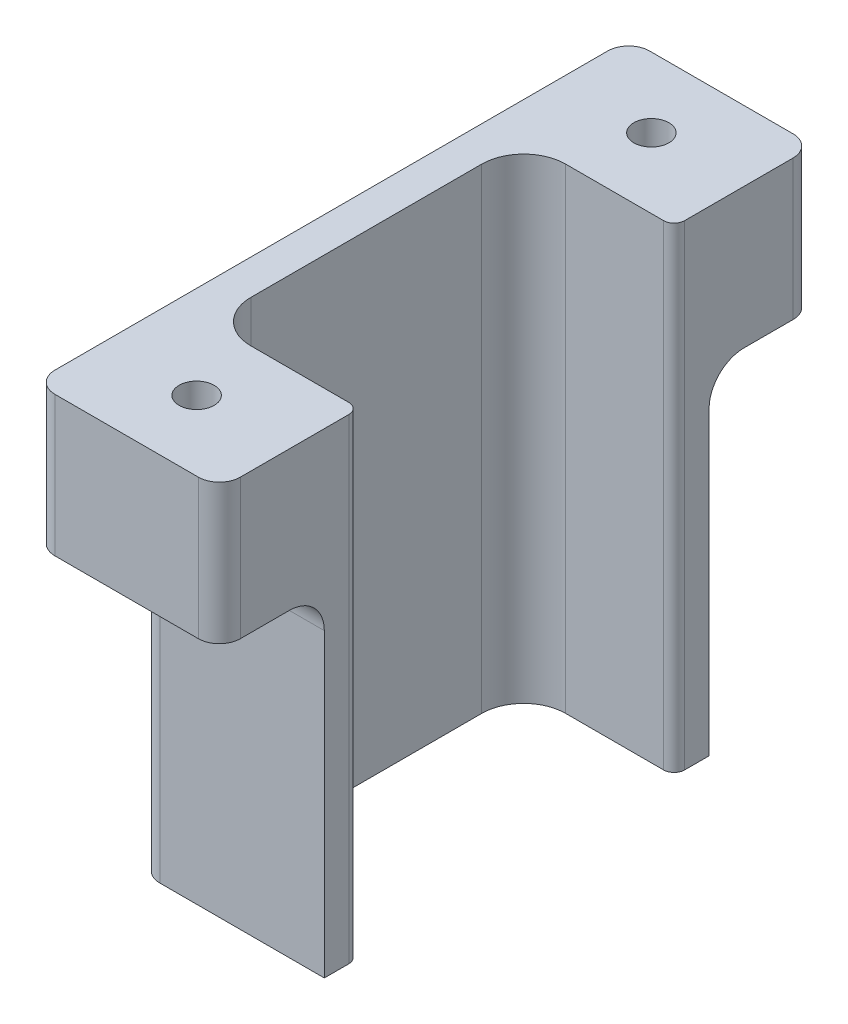
ISO-10303-21;
HEADER;
FILE_DESCRIPTION(('STEP AP214'),'2;1');
FILE_NAME('part.step','',(''),(''),'','','');
FILE_SCHEMA(('AUTOMOTIVE_DESIGN { 1 0 10303 214 1 1 1 1 }'));
ENDSEC;
DATA;
#1=APPLICATION_CONTEXT('core data for automotive mechanical design processes');
#2=APPLICATION_PROTOCOL_DEFINITION('international standard','automotive_design',2000,#1);
#3=PRODUCT_CONTEXT('',#1,'mechanical');
#4=PRODUCT('Part','Part','',(#3));
#5=PRODUCT_RELATED_PRODUCT_CATEGORY('part','',(#4));
#6=PRODUCT_DEFINITION_FORMATION('','',#4);
#7=PRODUCT_DEFINITION_CONTEXT('part definition',#1,'design');
#8=PRODUCT_DEFINITION('design','',#6,#7);
#9=PRODUCT_DEFINITION_SHAPE('','',#8);
#10=(LENGTH_UNIT() NAMED_UNIT(*) SI_UNIT(.MILLI.,.METRE.));
#11=(NAMED_UNIT(*) PLANE_ANGLE_UNIT() SI_UNIT($,.RADIAN.));
#12=(NAMED_UNIT(*) SI_UNIT($,.STERADIAN.) SOLID_ANGLE_UNIT());
#13=UNCERTAINTY_MEASURE_WITH_UNIT(LENGTH_MEASURE(1.E-05),#10,'distance_accuracy_value','');
#14=(GEOMETRIC_REPRESENTATION_CONTEXT(3) GLOBAL_UNCERTAINTY_ASSIGNED_CONTEXT((#13)) GLOBAL_UNIT_ASSIGNED_CONTEXT((#10,
#11,#12)) REPRESENTATION_CONTEXT('',''));
#15=CARTESIAN_POINT('',(0.,0.,0.));
#16=DIRECTION('',(0.,0.,1.));
#17=DIRECTION('',(1.,0.,0.));
#18=AXIS2_PLACEMENT_3D('',#15,#16,#17);
#19=CARTESIAN_POINT('',(-17.8800000000024,-68.,-42.499999999993));
#20=DIRECTION('',(-1.,0.,0.));
#21=DIRECTION('',(0.,0.,1.));
#22=AXIS2_PLACEMENT_3D('',#19,#20,#21);
#23=PLANE('',#22);
#24=DIRECTION('',(0.,0.,1.));
#25=VECTOR('',#24,1.);
#26=CARTESIAN_POINT('',(-17.8800000000018,-20.,-24.5000000000071));
#27=LINE('',#26,#25);
#28=CARTESIAN_POINT('',(-17.8800000000024,-20.,-39.500000000007));
#29=VERTEX_POINT('',#28);
#30=CARTESIAN_POINT('',(-17.8800000000021,-20.,-31.9161984871026));
#31=VERTEX_POINT('',#30);
#32=EDGE_CURVE('E249',#29,#31,#27,.T.);
#33=ORIENTED_EDGE('',*,*,#32,.T.);
#34=CARTESIAN_POINT('',(-17.8800000000021,-20.,-31.9161984871026));
#35=CARTESIAN_POINT('',(-17.8800000000023,-19.9999752730949,-31.7456852843473));
#36=CARTESIAN_POINT('',(-17.8800000000024,-20.0074935365896,-31.5752210421484));
#37=CARTESIAN_POINT('',(-17.8800000000025,-20.0369800495805,-31.2356908238179));
#38=CARTESIAN_POINT('',(-17.8800000000024,-20.0589355674878,-31.0666237484772));
#39=CARTESIAN_POINT('',(-17.8800000000024,-20.116463969022,-30.7320399614759));
#40=CARTESIAN_POINT('',(-17.8800000000024,-20.1519420271381,-30.5665068173239));
#41=CARTESIAN_POINT('',(-17.8800000000024,-20.2357731757258,-30.238702504611));
#42=CARTESIAN_POINT('',(-17.8800000000024,-20.2841301293885,-30.0764323305539));
#43=CARTESIAN_POINT('',(-17.8800000000024,-20.4069214648023,-29.7146234537957));
#44=CARTESIAN_POINT('',(-17.8800000000024,-20.4848649967622,-29.5162710714395));
#45=CARTESIAN_POINT('',(-17.8800000000024,-20.6579850710163,-29.1272491317108));
#46=CARTESIAN_POINT('',(-17.8800000000024,-20.7531650659685,-28.9365811229769));
#47=CARTESIAN_POINT('',(-17.8800000000024,-20.9589846921192,-28.5634220285451));
#48=CARTESIAN_POINT('',(-17.8800000000024,-21.0696489079492,-28.3809445678928));
#49=CARTESIAN_POINT('',(-17.8800000000024,-21.3043932006747,-28.0247740395487));
#50=CARTESIAN_POINT('',(-17.8800000000024,-21.4284787062314,-27.8510845684416));
#51=CARTESIAN_POINT('',(-17.8800000000024,-21.6768777004653,-27.5271148286793));
#52=CARTESIAN_POINT('',(-17.8800000000024,-21.8002489741906,-27.3761074431734));
#53=CARTESIAN_POINT('',(-17.8800000000024,-22.0551167288719,-27.0810870646629));
#54=CARTESIAN_POINT('',(-17.8800000000024,-22.1866151088374,-26.9370757205259));
#55=CARTESIAN_POINT('',(-17.8800000000025,-22.5914536856932,-26.5145394797686));
#56=CARTESIAN_POINT('',(-17.880000000003,-22.8749495256995,-26.245750264503));
#57=CARTESIAN_POINT('',(-17.8800000000018,-23.4594492174559,-25.7269875936144));
#58=CARTESIAN_POINT('',(-17.8800000000001,-23.760494827344,-25.4770625567149));
#59=CARTESIAN_POINT('',(-17.8800000000048,-24.3706229283548,-24.987621757178));
#60=CARTESIAN_POINT('',(-17.8800000000112,-24.6797026818117,-24.7481025211546));
#61=CARTESIAN_POINT('',(-17.8800000000023,-24.9925464416032,-24.5057735003997));
#62=CARTESIAN_POINT('',(-17.8800000000022,-24.9962732216266,-24.5028867490627));
#63=CARTESIAN_POINT('',(-17.8800000000021,-25.,-24.500000000007));
#64=B_SPLINE_CURVE_WITH_KNOTS('',3,(#34,#35,#36,#37,#38,#39,#40,#41,#42,#43,#44,#45,#46,#47,#48,
#49,#50,#51,#52,#53,#54,#55,#56,#57,#58,#59,#60,#61,#62,#63),.UNSPECIFIED.,.F.,.F.,(4,2,2,2,2,2,
2,2,2,2,2,2,2,2,4),(0.,0.511301398217874,1.02215250549165,1.52948533179293,2.03697051086635,
2.67538958433453,3.3139366820847,3.95350936853052,4.59334172451281,5.17800417118517,
5.76280375254001,6.93330785249414,8.10672075543524,9.27973892354765,9.29388105917143),.UNSPECIFIED.);
#65=CARTESIAN_POINT('',(-17.8800000000018,-25.,-24.5000000000071));
#66=VERTEX_POINT('',#65);
#67=EDGE_CURVE('E414',#31,#66,#64,.T.);
#68=ORIENTED_EDGE('',*,*,#67,.T.);
#69=DIRECTION('',(0.,-1.,0.));
#70=VECTOR('',#69,1.);
#71=CARTESIAN_POINT('',(-17.8800000000018,12.0351369592833,-24.5000000000071));
#72=LINE('',#71,#70);
#73=CARTESIAN_POINT('',(-17.8800000000018,-68.,-24.5000000000071));
#74=VERTEX_POINT('',#73);
#75=EDGE_CURVE('E247',#66,#74,#72,.T.);
#76=ORIENTED_EDGE('',*,*,#75,.T.);
#77=DIRECTION('',(0.,0.,1.));
#78=VECTOR('',#77,1.);
#79=CARTESIAN_POINT('',(-17.8800000000024,-68.,-42.499999999993));
#80=LINE('',#79,#78);
#81=CARTESIAN_POINT('',(-17.8800000000018,-68.,24.5000000000071));
#82=VERTEX_POINT('',#81);
#83=EDGE_CURVE('E353',#74,#82,#80,.T.);
#84=ORIENTED_EDGE('',*,*,#83,.T.);
#85=DIRECTION('',(0.,-1.,0.));
#86=VECTOR('',#85,1.);
#87=CARTESIAN_POINT('',(-17.8800000000018,12.0351369592833,24.5000000000071));
#88=LINE('',#87,#86);
#89=CARTESIAN_POINT('',(-17.8800000000018,-25.,24.5000000000071));
#90=VERTEX_POINT('',#89);
#91=EDGE_CURVE('E286',#90,#82,#88,.T.);
#92=ORIENTED_EDGE('',*,*,#91,.F.);
#93=CARTESIAN_POINT('',(-17.8800000000021,-20.,31.9161984871026));
#94=CARTESIAN_POINT('',(-17.8800000000023,-19.9999752730949,31.7456852843479));
#95=CARTESIAN_POINT('',(-17.8800000000024,-20.0074935365895,31.5752210421497));
#96=CARTESIAN_POINT('',(-17.8800000000025,-20.0369800495803,31.2356908238205));
#97=CARTESIAN_POINT('',(-17.8800000000024,-20.0589355674874,31.0666237484805));
#98=CARTESIAN_POINT('',(-17.8800000000024,-20.1164639690213,30.7320399614792));
#99=CARTESIAN_POINT('',(-17.8800000000024,-20.1519420271375,30.5665068173265));
#100=CARTESIAN_POINT('',(-17.8800000000024,-20.2357731757254,30.2387025046123));
#101=CARTESIAN_POINT('',(-17.8800000000024,-20.2841301293883,30.0764323305546));
#102=CARTESIAN_POINT('',(-17.8800000000024,-20.4069214648025,29.7146234537951));
#103=CARTESIAN_POINT('',(-17.8800000000024,-20.4848649967626,29.5162710714384));
#104=CARTESIAN_POINT('',(-17.8800000000024,-20.6579850710173,29.1272491317087));
#105=CARTESIAN_POINT('',(-17.8800000000024,-20.7531650659699,28.9365811229744));
#106=CARTESIAN_POINT('',(-17.8800000000024,-20.9589846921207,28.5634220285427));
#107=CARTESIAN_POINT('',(-17.8800000000024,-21.0696489079504,28.3809445678909));
#108=CARTESIAN_POINT('',(-17.8800000000024,-21.3043932006753,28.0247740395478));
#109=CARTESIAN_POINT('',(-17.8800000000024,-21.4284787062317,27.8510845684411));
#110=CARTESIAN_POINT('',(-17.8800000000024,-21.6768777004652,27.5271148286794));
#111=CARTESIAN_POINT('',(-17.8800000000024,-21.8002489741904,27.3761074431737));
#112=CARTESIAN_POINT('',(-17.8800000000024,-22.0551167288715,27.0810870646633));
#113=CARTESIAN_POINT('',(-17.8800000000024,-22.1866151088367,26.9370757205262));
#114=CARTESIAN_POINT('',(-17.8800000000025,-22.5914536856921,26.5145394797704));
#115=CARTESIAN_POINT('',(-17.880000000003,-22.8749495256988,26.2457502645071));
#116=CARTESIAN_POINT('',(-17.8800000000018,-23.4594492174515,25.7269875936149));
#117=CARTESIAN_POINT('',(-17.8800000000001,-23.7604948273356,25.4770625567094));
#118=CARTESIAN_POINT('',(-17.8800000000048,-24.3706229283592,24.9876217571867));
#119=CARTESIAN_POINT('',(-17.8800000000112,-24.679702681833,24.7481025211837));
#120=CARTESIAN_POINT('',(-17.8800000000023,-24.9925464416037,24.5057735004004));
#121=CARTESIAN_POINT('',(-17.8800000000022,-24.9962732216269,24.502886749063));
#122=CARTESIAN_POINT('',(-17.8800000000021,-25.,24.500000000007));
#123=B_SPLINE_CURVE_WITH_KNOTS('',3,(#93,#94,#95,#96,#97,#98,#99,#100,#101,#102,#103,#104,#105,
#106,#107,#108,#109,#110,#111,#112,#113,#114,#115,#116,#117,#118,#119,#120,#121,#122),
.UNSPECIFIED.,.F.,.F.,(4,2,2,2,2,2,2,2,2,2,2,2,2,2,4),(0.,0.511301398215926,1.02215250548769,
1.52948533179091,2.03697051086635,2.67538958433635,3.3139366820881,3.9535093685322,
4.59334172451282,5.17800417118479,5.7628037525391,6.93330785248986,8.10672075543246,
9.27973892354754,9.29388105917142),.UNSPECIFIED.);
#124=CARTESIAN_POINT('',(-17.8800000000021,-20.,31.9161984871026));
#125=VERTEX_POINT('',#124);
#126=EDGE_CURVE('E422',#90,#125,#123,.F.);
#127=ORIENTED_EDGE('',*,*,#126,.T.);
#128=DIRECTION('',(0.,0.,-1.));
#129=VECTOR('',#128,1.);
#130=CARTESIAN_POINT('',(-17.8800000000018,-20.,24.5000000000071));
#131=LINE('',#130,#129);
#132=CARTESIAN_POINT('',(-17.8800000000024,-20.,39.500000000007));
#133=VERTEX_POINT('',#132);
#134=EDGE_CURVE('E274',#133,#125,#131,.T.);
#135=ORIENTED_EDGE('',*,*,#134,.F.);
#136=DIRECTION('',(0.,1.,0.));
#137=VECTOR('',#136,1.);
#138=CARTESIAN_POINT('',(-17.8800000000024,-68.,39.500000000007));
#139=LINE('',#138,#137);
#140=CARTESIAN_POINT('',(-17.8800000000024,0.,39.500000000007));
#141=VERTEX_POINT('',#140);
#142=EDGE_CURVE('E382',#133,#141,#139,.T.);
#143=ORIENTED_EDGE('',*,*,#142,.T.);
#144=DIRECTION('',(0.,0.,1.));
#145=VECTOR('',#144,1.);
#146=CARTESIAN_POINT('',(-17.8800000000024,0.,-42.499999999993));
#147=LINE('',#146,#145);
#148=CARTESIAN_POINT('',(-17.8800000000024,0.,-39.499999999993));
#149=VERTEX_POINT('',#148);
#150=EDGE_CURVE('E364',#149,#141,#147,.T.);
#151=ORIENTED_EDGE('',*,*,#150,.F.);
#152=DIRECTION('',(0.,1.,0.));
#153=VECTOR('',#152,1.);
#154=CARTESIAN_POINT('',(-17.8800000000024,-68.,-39.499999999993));
#155=LINE('',#154,#153);
#156=EDGE_CURVE('E384',#149,#29,#155,.F.);
#157=ORIENTED_EDGE('',*,*,#156,.T.);
#158=EDGE_LOOP('',(#33,#68,#76,#84,#92,#127,#135,#143,#151,#157));
#159=FACE_BOUND('',#158,.T.);
#160=ADVANCED_FACE('F49',(#159),#23,.T.);
#161=CARTESIAN_POINT('',(0.,-68.,0.));
#162=DIRECTION('',(0.,1.,0.));
#163=DIRECTION('',(0.,0.,1.));
#164=AXIS2_PLACEMENT_3D('',#161,#162,#163);
#165=PLANE('',#164);
#166=CARTESIAN_POINT('',(-14.8800000000018,-68.,-24.500000000007));
#167=DIRECTION('',(0.,-1.,0.));
#168=DIRECTION('',(0.,0.,-1.));
#169=AXIS2_PLACEMENT_3D('',#166,#167,#168);
#170=CIRCLE('',#169,3.);
#171=CARTESIAN_POINT('',(-14.8800000000018,-68.,-27.500000000007));
#172=VERTEX_POINT('',#171);
#173=EDGE_CURVE('E256',#74,#172,#170,.T.);
#174=ORIENTED_EDGE('',*,*,#173,.T.);
#175=DIRECTION('',(1.,0.,0.));
#176=VECTOR('',#175,1.);
#177=CARTESIAN_POINT('',(-14.8800000000018,-68.,-27.500000000007));
#178=LINE('',#177,#176);
#179=CARTESIAN_POINT('',(8.61999999999824,-68.,-27.5000000000068));
#180=VERTEX_POINT('',#179);
#181=EDGE_CURVE('E259',#172,#180,#178,.T.);
#182=ORIENTED_EDGE('',*,*,#181,.T.);
#183=DIRECTION('',(0.,0.,-1.));
#184=VECTOR('',#183,1.);
#185=CARTESIAN_POINT('',(8.61999999999824,-68.,-42.499999999993));
#186=LINE('',#185,#184);
#187=CARTESIAN_POINT('',(8.61999999999786,-68.,-23.9999999999932));
#188=VERTEX_POINT('',#187);
#189=EDGE_CURVE('E354',#188,#180,#186,.T.);
#190=ORIENTED_EDGE('',*,*,#189,.F.);
#191=CARTESIAN_POINT('',(7.11999999999785,-68.,-23.9999999999932));
#192=DIRECTION('',(0.,1.,0.));
#193=DIRECTION('',(0.,0.,1.));
#194=AXIS2_PLACEMENT_3D('',#191,#192,#193);
#195=CIRCLE('',#194,1.50000000000001);
#196=CARTESIAN_POINT('',(7.11999999999785,-68.,-22.4999999999932));
#197=VERTEX_POINT('',#196);
#198=EDGE_CURVE('E280',#197,#188,#195,.T.);
#199=ORIENTED_EDGE('',*,*,#198,.F.);
#200=DIRECTION('',(1.,0.,0.));
#201=VECTOR('',#200,1.);
#202=CARTESIAN_POINT('',(-6.88000000000216,-68.,-22.4999999999931));
#203=LINE('',#202,#201);
#204=CARTESIAN_POINT('',(-6.88000000000216,-68.,-22.4999999999931));
#205=VERTEX_POINT('',#204);
#206=EDGE_CURVE('E295',#205,#197,#203,.T.);
#207=ORIENTED_EDGE('',*,*,#206,.F.);
#208=CARTESIAN_POINT('',(-6.88000000000211,-68.,-16.4999999999931));
#209=DIRECTION('',(0.,1.,0.));
#210=DIRECTION('',(0.,0.,1.));
#211=AXIS2_PLACEMENT_3D('',#208,#209,#210);
#212=CIRCLE('',#211,6.00000000000001);
#213=CARTESIAN_POINT('',(-12.8800000000021,-68.,-16.499999999993));
#214=VERTEX_POINT('',#213);
#215=EDGE_CURVE('E298',#214,#205,#212,.F.);
#216=ORIENTED_EDGE('',*,*,#215,.F.);
#217=DIRECTION('',(0.,0.,-1.));
#218=VECTOR('',#217,1.);
#219=CARTESIAN_POINT('',(-12.8800000000018,-68.,16.500000000007));
#220=LINE('',#219,#218);
#221=CARTESIAN_POINT('',(-12.8800000000018,-68.,16.500000000007));
#222=VERTEX_POINT('',#221);
#223=EDGE_CURVE('E301',#222,#214,#220,.T.);
#224=ORIENTED_EDGE('',*,*,#223,.F.);
#225=CARTESIAN_POINT('',(-6.88000000000177,-68.,16.5000000000069));
#226=DIRECTION('',(0.,1.,0.));
#227=DIRECTION('',(0.,0.,1.));
#228=AXIS2_PLACEMENT_3D('',#225,#226,#227);
#229=CIRCLE('',#228,6.);
#230=CARTESIAN_POINT('',(-6.88000000000177,-68.,22.5000000000069));
#231=VERTEX_POINT('',#230);
#232=EDGE_CURVE('E304',#231,#222,#229,.F.);
#233=ORIENTED_EDGE('',*,*,#232,.F.);
#234=DIRECTION('',(-1.,0.,0.));
#235=VECTOR('',#234,1.);
#236=CARTESIAN_POINT('',(7.11999999999829,-68.,22.5000000000068));
#237=LINE('',#236,#235);
#238=CARTESIAN_POINT('',(7.11999999999829,-68.,22.5000000000068));
#239=VERTEX_POINT('',#238);
#240=EDGE_CURVE('E307',#239,#231,#237,.T.);
#241=ORIENTED_EDGE('',*,*,#240,.F.);
#242=CARTESIAN_POINT('',(7.11999999999835,-68.,24.0000000000068));
#243=DIRECTION('',(0.,1.,0.));
#244=DIRECTION('',(0.,0.,1.));
#245=AXIS2_PLACEMENT_3D('',#242,#243,#244);
#246=CIRCLE('',#245,1.5);
#247=CARTESIAN_POINT('',(8.61999999999825,-68.,24.0000000000068));
#248=VERTEX_POINT('',#247);
#249=EDGE_CURVE('E310',#248,#239,#246,.T.);
#250=ORIENTED_EDGE('',*,*,#249,.F.);
#251=CARTESIAN_POINT('',(8.61999999999824,-68.,27.5000000000068));
#252=VERTEX_POINT('',#251);
#253=EDGE_CURVE('E351',#252,#248,#186,.T.);
#254=ORIENTED_EDGE('',*,*,#253,.F.);
#255=DIRECTION('',(1.,0.,0.));
#256=VECTOR('',#255,1.);
#257=CARTESIAN_POINT('',(-14.8800000000018,-68.,27.500000000007));
#258=LINE('',#257,#256);
#259=CARTESIAN_POINT('',(-14.8800000000018,-68.,27.500000000007));
#260=VERTEX_POINT('',#259);
#261=EDGE_CURVE('E270',#260,#252,#258,.T.);
#262=ORIENTED_EDGE('',*,*,#261,.F.);
#263=CARTESIAN_POINT('',(-14.8800000000018,-68.,24.500000000007));
#264=DIRECTION('',(0.,1.,0.));
#265=DIRECTION('',(0.,0.,1.));
#266=AXIS2_PLACEMENT_3D('',#263,#264,#265);
#267=CIRCLE('',#266,3.);
#268=EDGE_CURVE('E283',#82,#260,#267,.T.);
#269=ORIENTED_EDGE('',*,*,#268,.F.);
#270=ORIENTED_EDGE('',*,*,#83,.F.);
#271=EDGE_LOOP('',(#174,#182,#190,#199,#207,#216,#224,#233,#241,#250,#254,#262,#269,#270));
#272=FACE_BOUND('',#271,.T.);
#273=ADVANCED_FACE('F436',(#272),#165,.F.);
#274=CARTESIAN_POINT('',(8.61999999999824,-68.,-42.499999999993));
#275=DIRECTION('',(1.,0.,0.));
#276=DIRECTION('',(0.,0.,-1.));
#277=AXIS2_PLACEMENT_3D('',#274,#275,#276);
#278=PLANE('',#277);
#279=ORIENTED_EDGE('',*,*,#189,.T.);
#280=DIRECTION('',(0.,-1.,0.));
#281=VECTOR('',#280,1.);
#282=CARTESIAN_POINT('',(8.61999999999824,12.0351369592833,-27.5000000000068));
#283=LINE('',#282,#281);
#284=CARTESIAN_POINT('',(8.61999999999824,-25.,-27.5000000000068));
#285=VERTEX_POINT('',#284);
#286=EDGE_CURVE('E263',#285,#180,#283,.T.);
#287=ORIENTED_EDGE('',*,*,#286,.F.);
#288=CARTESIAN_POINT('',(8.61999999999824,-25.,-32.5000000000068));
#289=DIRECTION('',(1.,0.,0.));
#290=DIRECTION('',(0.,0.,-1.));
#291=AXIS2_PLACEMENT_3D('',#288,#289,#290);
#292=CIRCLE('',#291,5.);
#293=CARTESIAN_POINT('',(8.61999999999824,-20.,-32.5000000000068));
#294=VERTEX_POINT('',#293);
#295=EDGE_CURVE('E58',#285,#294,#292,.F.);
#296=ORIENTED_EDGE('',*,*,#295,.T.);
#297=DIRECTION('',(0.,0.,-1.));
#298=VECTOR('',#297,1.);
#299=CARTESIAN_POINT('',(8.61999999999825,-20.,-39.500000000007));
#300=LINE('',#299,#298);
#301=CARTESIAN_POINT('',(8.61999999999825,-20.,-39.500000000007));
#302=VERTEX_POINT('',#301);
#303=EDGE_CURVE('E246',#294,#302,#300,.T.);
#304=ORIENTED_EDGE('',*,*,#303,.T.);
#305=DIRECTION('',(0.,1.,0.));
#306=VECTOR('',#305,1.);
#307=CARTESIAN_POINT('',(8.61999999999824,-68.,-39.499999999993));
#308=LINE('',#307,#306);
#309=CARTESIAN_POINT('',(8.61999999999824,0.,-39.499999999993));
#310=VERTEX_POINT('',#309);
#311=EDGE_CURVE('E390',#302,#310,#308,.T.);
#312=ORIENTED_EDGE('',*,*,#311,.T.);
#313=DIRECTION('',(0.,0.,-1.));
#314=VECTOR('',#313,1.);
#315=CARTESIAN_POINT('',(8.61999999999824,0.,-42.499999999993));
#316=LINE('',#315,#314);
#317=CARTESIAN_POINT('',(8.61999999999824,0.,-23.9999999999932));
#318=VERTEX_POINT('',#317);
#319=EDGE_CURVE('E336',#318,#310,#316,.T.);
#320=ORIENTED_EDGE('',*,*,#319,.F.);
#321=DIRECTION('',(0.,1.,0.));
#322=VECTOR('',#321,1.);
#323=CARTESIAN_POINT('',(8.61999999999786,-68.001,-23.9999999999932));
#324=LINE('',#323,#322);
#325=EDGE_CURVE('E347',#188,#318,#324,.T.);
#326=ORIENTED_EDGE('',*,*,#325,.F.);
#327=EDGE_LOOP('',(#279,#287,#296,#304,#312,#320,#326));
#328=FACE_BOUND('',#327,.T.);
#329=ADVANCED_FACE('F445',(#328),#278,.T.);
#330=CARTESIAN_POINT('',(-17.8800000000024,-68.,-42.499999999993));
#331=DIRECTION('',(0.,0.,-1.));
#332=DIRECTION('',(-1.,0.,0.));
#333=AXIS2_PLACEMENT_3D('',#330,#331,#332);
#334=PLANE('',#333);
#335=DIRECTION('',(0.,1.,0.));
#336=VECTOR('',#335,1.);
#337=CARTESIAN_POINT('',(5.61999999999824,-68.,-42.499999999993));
#338=LINE('',#337,#336);
#339=CARTESIAN_POINT('',(5.61999999999824,0.,-42.499999999993));
#340=VERTEX_POINT('',#339);
#341=CARTESIAN_POINT('',(5.61999999999824,-20.,-42.499999999993));
#342=VERTEX_POINT('',#341);
#343=EDGE_CURVE('E357',#340,#342,#338,.F.);
#344=ORIENTED_EDGE('',*,*,#343,.T.);
#345=DIRECTION('',(-1.,0.,0.));
#346=VECTOR('',#345,1.);
#347=CARTESIAN_POINT('',(-14.8800000000024,-20.,-42.500000000007));
#348=LINE('',#347,#346);
#349=CARTESIAN_POINT('',(-14.8800000000024,-20.,-42.500000000007));
#350=VERTEX_POINT('',#349);
#351=EDGE_CURVE('E255',#342,#350,#348,.T.);
#352=ORIENTED_EDGE('',*,*,#351,.T.);
#353=DIRECTION('',(0.,1.,0.));
#354=VECTOR('',#353,1.);
#355=CARTESIAN_POINT('',(-14.8800000000024,-68.,-42.499999999993));
#356=LINE('',#355,#354);
#357=CARTESIAN_POINT('',(-14.8800000000024,0.,-42.499999999993));
#358=VERTEX_POINT('',#357);
#359=EDGE_CURVE('E372',#350,#358,#356,.T.);
#360=ORIENTED_EDGE('',*,*,#359,.T.);
#361=DIRECTION('',(-1.,0.,0.));
#362=VECTOR('',#361,1.);
#363=CARTESIAN_POINT('',(-17.8800000000024,0.,-42.499999999993));
#364=LINE('',#363,#362);
#365=EDGE_CURVE('E361',#340,#358,#364,.T.);
#366=ORIENTED_EDGE('',*,*,#365,.F.);
#367=EDGE_LOOP('',(#344,#352,#360,#366));
#368=FACE_BOUND('',#367,.T.);
#369=ADVANCED_FACE('F440',(#368),#334,.T.);
#370=CARTESIAN_POINT('',(-14.8800000000024,-68.,-39.499999999993));
#371=DIRECTION('',(0.,1.,0.));
#372=DIRECTION('',(0.,0.,1.));
#373=AXIS2_PLACEMENT_3D('',#370,#371,#372);
#374=CYLINDRICAL_SURFACE('',#373,3.);
#375=ORIENTED_EDGE('',*,*,#359,.F.);
#376=CARTESIAN_POINT('',(-14.8800000000024,-20.,-39.500000000007));
#377=DIRECTION('',(0.,-1.,0.));
#378=DIRECTION('',(0.,0.,-1.));
#379=AXIS2_PLACEMENT_3D('',#376,#377,#378);
#380=CIRCLE('',#379,3.);
#381=EDGE_CURVE('E252',#350,#29,#380,.F.);
#382=ORIENTED_EDGE('',*,*,#381,.T.);
#383=ORIENTED_EDGE('',*,*,#156,.F.);
#384=CARTESIAN_POINT('',(-14.8800000000024,0.,-39.499999999993));
#385=DIRECTION('',(0.,1.,0.));
#386=DIRECTION('',(0.,0.,1.));
#387=AXIS2_PLACEMENT_3D('',#384,#385,#386);
#388=CIRCLE('',#387,3.);
#389=EDGE_CURVE('E380',#358,#149,#388,.T.);
#390=ORIENTED_EDGE('',*,*,#389,.F.);
#391=EDGE_LOOP('',(#375,#382,#383,#390));
#392=FACE_BOUND('',#391,.T.);
#393=ADVANCED_FACE('F444',(#392),#374,.T.);
#394=CARTESIAN_POINT('',(5.61999999999824,-68.,-39.499999999993));
#395=DIRECTION('',(0.,1.,0.));
#396=DIRECTION('',(0.,0.,1.));
#397=AXIS2_PLACEMENT_3D('',#394,#395,#396);
#398=CYLINDRICAL_SURFACE('',#397,3.);
#399=ORIENTED_EDGE('',*,*,#311,.F.);
#400=CARTESIAN_POINT('',(5.61999999999825,-20.,-39.500000000007));
#401=DIRECTION('',(0.,-1.,0.));
#402=DIRECTION('',(0.,0.,-1.));
#403=AXIS2_PLACEMENT_3D('',#400,#401,#402);
#404=CIRCLE('',#403,3.);
#405=EDGE_CURVE('E243',#302,#342,#404,.F.);
#406=ORIENTED_EDGE('',*,*,#405,.T.);
#407=ORIENTED_EDGE('',*,*,#343,.F.);
#408=CARTESIAN_POINT('',(5.61999999999824,0.,-39.499999999993));
#409=DIRECTION('',(0.,1.,0.));
#410=DIRECTION('',(0.,0.,1.));
#411=AXIS2_PLACEMENT_3D('',#408,#409,#410);
#412=CIRCLE('',#411,3.);
#413=EDGE_CURVE('E378',#310,#340,#412,.T.);
#414=ORIENTED_EDGE('',*,*,#413,.F.);
#415=EDGE_LOOP('',(#399,#406,#407,#414));
#416=FACE_BOUND('',#415,.T.);
#417=ADVANCED_FACE('F454',(#416),#398,.T.);
#418=CARTESIAN_POINT('',(-17.8800000000024,-68.,42.500000000007));
#419=DIRECTION('',(0.,0.,1.));
#420=DIRECTION('',(1.,0.,0.));
#421=AXIS2_PLACEMENT_3D('',#418,#419,#420);
#422=PLANE('',#421);
#423=DIRECTION('',(0.,1.,0.));
#424=VECTOR('',#423,1.);
#425=CARTESIAN_POINT('',(-14.8800000000024,-68.,42.500000000007));
#426=LINE('',#425,#424);
#427=CARTESIAN_POINT('',(-14.8800000000024,0.,42.500000000007));
#428=VERTEX_POINT('',#427);
#429=CARTESIAN_POINT('',(-14.8800000000024,-20.,42.500000000007));
#430=VERTEX_POINT('',#429);
#431=EDGE_CURVE('E394',#428,#430,#426,.F.);
#432=ORIENTED_EDGE('',*,*,#431,.T.);
#433=DIRECTION('',(-1.,0.,0.));
#434=VECTOR('',#433,1.);
#435=CARTESIAN_POINT('',(-14.8800000000024,-20.,42.500000000007));
#436=LINE('',#435,#434);
#437=CARTESIAN_POINT('',(5.61999999999825,-20.,42.500000000007));
#438=VERTEX_POINT('',#437);
#439=EDGE_CURVE('E276',#438,#430,#436,.T.);
#440=ORIENTED_EDGE('',*,*,#439,.F.);
#441=DIRECTION('',(0.,1.,0.));
#442=VECTOR('',#441,1.);
#443=CARTESIAN_POINT('',(5.61999999999825,-68.,42.500000000007));
#444=LINE('',#443,#442);
#445=CARTESIAN_POINT('',(5.61999999999825,0.,42.500000000007));
#446=VERTEX_POINT('',#445);
#447=EDGE_CURVE('E392',#438,#446,#444,.T.);
#448=ORIENTED_EDGE('',*,*,#447,.T.);
#449=DIRECTION('',(1.,0.,0.));
#450=VECTOR('',#449,1.);
#451=CARTESIAN_POINT('',(-17.8800000000024,0.,42.500000000007));
#452=LINE('',#451,#450);
#453=EDGE_CURVE('E367',#428,#446,#452,.T.);
#454=ORIENTED_EDGE('',*,*,#453,.F.);
#455=EDGE_LOOP('',(#432,#440,#448,#454));
#456=FACE_BOUND('',#455,.T.);
#457=ADVANCED_FACE('F438',(#456),#422,.T.);
#458=CARTESIAN_POINT('',(-14.8800000000024,-68.,39.500000000007));
#459=DIRECTION('',(0.,1.,0.));
#460=DIRECTION('',(0.,0.,1.));
#461=AXIS2_PLACEMENT_3D('',#458,#459,#460);
#462=CYLINDRICAL_SURFACE('',#461,3.);
#463=ORIENTED_EDGE('',*,*,#142,.F.);
#464=CARTESIAN_POINT('',(-14.8800000000024,-20.,39.500000000007));
#465=DIRECTION('',(0.,-1.,0.));
#466=DIRECTION('',(0.,0.,-1.));
#467=AXIS2_PLACEMENT_3D('',#464,#465,#466);
#468=CIRCLE('',#467,3.);
#469=EDGE_CURVE('E278',#430,#133,#468,.T.);
#470=ORIENTED_EDGE('',*,*,#469,.F.);
#471=ORIENTED_EDGE('',*,*,#431,.F.);
#472=CARTESIAN_POINT('',(-14.8800000000024,0.,39.500000000007));
#473=DIRECTION('',(0.,1.,0.));
#474=DIRECTION('',(0.,0.,1.));
#475=AXIS2_PLACEMENT_3D('',#472,#473,#474);
#476=CIRCLE('',#475,3.);
#477=EDGE_CURVE('E376',#141,#428,#476,.T.);
#478=ORIENTED_EDGE('',*,*,#477,.F.);
#479=EDGE_LOOP('',(#463,#470,#471,#478));
#480=FACE_BOUND('',#479,.T.);
#481=ADVANCED_FACE('F459',(#480),#462,.T.);
#482=CARTESIAN_POINT('',(5.61999999999825,-68.,39.500000000007));
#483=DIRECTION('',(0.,1.,0.));
#484=DIRECTION('',(0.,0.,1.));
#485=AXIS2_PLACEMENT_3D('',#482,#483,#484);
#486=CYLINDRICAL_SURFACE('',#485,3.);
#487=ORIENTED_EDGE('',*,*,#447,.F.);
#488=CARTESIAN_POINT('',(5.61999999999825,-20.,39.500000000007));
#489=DIRECTION('',(0.,-1.,0.));
#490=DIRECTION('',(0.,0.,-1.));
#491=AXIS2_PLACEMENT_3D('',#488,#489,#490);
#492=CIRCLE('',#491,3.);
#493=CARTESIAN_POINT('',(8.61999999999825,-20.,39.500000000007));
#494=VERTEX_POINT('',#493);
#495=EDGE_CURVE('E273',#494,#438,#492,.T.);
#496=ORIENTED_EDGE('',*,*,#495,.F.);
#497=DIRECTION('',(0.,1.,0.));
#498=VECTOR('',#497,1.);
#499=CARTESIAN_POINT('',(8.61999999999825,-68.,39.500000000007));
#500=LINE('',#499,#498);
#501=CARTESIAN_POINT('',(8.61999999999825,0.,39.500000000007));
#502=VERTEX_POINT('',#501);
#503=EDGE_CURVE('E387',#502,#494,#500,.F.);
#504=ORIENTED_EDGE('',*,*,#503,.F.);
#505=CARTESIAN_POINT('',(5.61999999999825,0.,39.500000000007));
#506=DIRECTION('',(0.,1.,0.));
#507=DIRECTION('',(0.,0.,1.));
#508=AXIS2_PLACEMENT_3D('',#505,#506,#507);
#509=CIRCLE('',#508,3.);
#510=EDGE_CURVE('E374',#446,#502,#509,.T.);
#511=ORIENTED_EDGE('',*,*,#510,.F.);
#512=EDGE_LOOP('',(#487,#496,#504,#511));
#513=FACE_BOUND('',#512,.T.);
#514=ADVANCED_FACE('F451',(#513),#486,.T.);
#515=DIRECTION('',(0.,0.,1.));
#516=VECTOR('',#515,1.);
#517=CARTESIAN_POINT('',(8.61999999999825,-20.,39.500000000007));
#518=LINE('',#517,#516);
#519=CARTESIAN_POINT('',(8.61999999999824,-20.,32.5000000000068));
#520=VERTEX_POINT('',#519);
#521=EDGE_CURVE('E271',#520,#494,#518,.T.);
#522=ORIENTED_EDGE('',*,*,#521,.F.);
#523=CARTESIAN_POINT('',(8.61999999999825,-25.,32.5000000000068));
#524=DIRECTION('',(1.,0.,0.));
#525=DIRECTION('',(0.,0.,-1.));
#526=AXIS2_PLACEMENT_3D('',#523,#524,#525);
#527=CIRCLE('',#526,5.);
#528=CARTESIAN_POINT('',(8.61999999999824,-25.,27.5000000000068));
#529=VERTEX_POINT('',#528);
#530=EDGE_CURVE('E11',#520,#529,#527,.F.);
#531=ORIENTED_EDGE('',*,*,#530,.T.);
#532=DIRECTION('',(0.,-1.,0.));
#533=VECTOR('',#532,1.);
#534=CARTESIAN_POINT('',(8.61999999999824,12.0351369592833,27.5000000000068));
#535=LINE('',#534,#533);
#536=EDGE_CURVE('E290',#529,#252,#535,.T.);
#537=ORIENTED_EDGE('',*,*,#536,.T.);
#538=ORIENTED_EDGE('',*,*,#253,.T.);
#539=DIRECTION('',(0.,1.,0.));
#540=VECTOR('',#539,1.);
#541=CARTESIAN_POINT('',(8.61999999999835,-68.001,24.0000000000068));
#542=LINE('',#541,#540);
#543=CARTESIAN_POINT('',(8.61999999999835,0.,24.0000000000068));
#544=VERTEX_POINT('',#543);
#545=EDGE_CURVE('E333',#248,#544,#542,.T.);
#546=ORIENTED_EDGE('',*,*,#545,.T.);
#547=EDGE_CURVE('E358',#502,#544,#316,.T.);
#548=ORIENTED_EDGE('',*,*,#547,.F.);
#549=ORIENTED_EDGE('',*,*,#503,.T.);
#550=EDGE_LOOP('',(#522,#531,#537,#538,#546,#548,#549));
#551=FACE_BOUND('',#550,.T.);
#552=ADVANCED_FACE('F447',(#551),#278,.T.);
#553=CARTESIAN_POINT('',(0.,0.,0.));
#554=DIRECTION('',(0.,1.,0.));
#555=DIRECTION('',(0.,0.,1.));
#556=AXIS2_PLACEMENT_3D('',#553,#554,#555);
#557=PLANE('',#556);
#558=CARTESIAN_POINT('',(-4.6300000000021,0.,-32.4999999999931));
#559=DIRECTION('',(0.,1.,0.));
#560=DIRECTION('',(0.,0.,1.));
#561=AXIS2_PLACEMENT_3D('',#558,#559,#560);
#562=CIRCLE('',#561,2.49999999999999);
#563=CARTESIAN_POINT('',(-4.6300000000021,0.,-29.9999999999931));
#564=VERTEX_POINT('',#563);
#565=EDGE_CURVE('E233',#564,#564,#562,.T.);
#566=ORIENTED_EDGE('',*,*,#565,.F.);
#567=EDGE_LOOP('',(#566));
#568=FACE_BOUND('',#567,.T.);
#569=CARTESIAN_POINT('',(-4.63000000000209,0.,32.500000000007));
#570=DIRECTION('',(0.,1.,0.));
#571=DIRECTION('',(0.,0.,1.));
#572=AXIS2_PLACEMENT_3D('',#569,#570,#571);
#573=CIRCLE('',#572,2.49999999999999);
#574=CARTESIAN_POINT('',(-4.63000000000209,0.,35.000000000007));
#575=VERTEX_POINT('',#574);
#576=EDGE_CURVE('E232',#575,#575,#573,.T.);
#577=ORIENTED_EDGE('',*,*,#576,.F.);
#578=EDGE_LOOP('',(#577));
#579=FACE_BOUND('',#578,.T.);
#580=CARTESIAN_POINT('',(7.11999999999835,0.,24.0000000000068));
#581=DIRECTION('',(0.,-1.,0.));
#582=DIRECTION('',(0.,0.,1.));
#583=AXIS2_PLACEMENT_3D('',#580,#581,#582);
#584=CIRCLE('',#583,1.5);
#585=CARTESIAN_POINT('',(7.11999999999829,0.,22.5000000000068));
#586=VERTEX_POINT('',#585);
#587=EDGE_CURVE('E313',#586,#544,#584,.T.);
#588=ORIENTED_EDGE('',*,*,#587,.F.);
#589=DIRECTION('',(1.,0.,0.));
#590=VECTOR('',#589,1.);
#591=CARTESIAN_POINT('',(7.11999999999829,0.,22.5000000000068));
#592=LINE('',#591,#590);
#593=CARTESIAN_POINT('',(-6.88000000000177,0.,22.5000000000069));
#594=VERTEX_POINT('',#593);
#595=EDGE_CURVE('E330',#594,#586,#592,.T.);
#596=ORIENTED_EDGE('',*,*,#595,.F.);
#597=CARTESIAN_POINT('',(-6.88000000000177,0.,16.5000000000069));
#598=DIRECTION('',(0.,1.,0.));
#599=DIRECTION('',(0.,0.,1.));
#600=AXIS2_PLACEMENT_3D('',#597,#598,#599);
#601=CIRCLE('',#600,6.);
#602=CARTESIAN_POINT('',(-12.8800000000018,0.,16.500000000007));
#603=VERTEX_POINT('',#602);
#604=EDGE_CURVE('E327',#603,#594,#601,.T.);
#605=ORIENTED_EDGE('',*,*,#604,.F.);
#606=DIRECTION('',(0.,0.,1.));
#607=VECTOR('',#606,1.);
#608=CARTESIAN_POINT('',(-12.8800000000018,0.,16.500000000007));
#609=LINE('',#608,#607);
#610=CARTESIAN_POINT('',(-12.8800000000021,0.,-16.499999999993));
#611=VERTEX_POINT('',#610);
#612=EDGE_CURVE('E324',#611,#603,#609,.T.);
#613=ORIENTED_EDGE('',*,*,#612,.F.);
#614=CARTESIAN_POINT('',(-6.88000000000211,0.,-16.4999999999931));
#615=DIRECTION('',(0.,1.,0.));
#616=DIRECTION('',(0.,0.,1.));
#617=AXIS2_PLACEMENT_3D('',#614,#615,#616);
#618=CIRCLE('',#617,6.00000000000001);
#619=CARTESIAN_POINT('',(-6.88000000000216,0.,-22.4999999999931));
#620=VERTEX_POINT('',#619);
#621=EDGE_CURVE('E321',#620,#611,#618,.T.);
#622=ORIENTED_EDGE('',*,*,#621,.F.);
#623=DIRECTION('',(-1.,0.,0.));
#624=VECTOR('',#623,1.);
#625=CARTESIAN_POINT('',(-6.88000000000216,0.,-22.4999999999931));
#626=LINE('',#625,#624);
#627=CARTESIAN_POINT('',(7.11999999999785,0.,-22.4999999999932));
#628=VERTEX_POINT('',#627);
#629=EDGE_CURVE('E318',#628,#620,#626,.T.);
#630=ORIENTED_EDGE('',*,*,#629,.F.);
#631=CARTESIAN_POINT('',(7.11999999999785,0.,-23.9999999999932));
#632=DIRECTION('',(0.,-1.,0.));
#633=DIRECTION('',(0.,0.,1.));
#634=AXIS2_PLACEMENT_3D('',#631,#632,#633);
#635=CIRCLE('',#634,1.50000000000001);
#636=EDGE_CURVE('E315',#318,#628,#635,.T.);
#637=ORIENTED_EDGE('',*,*,#636,.F.);
#638=ORIENTED_EDGE('',*,*,#319,.T.);
#639=ORIENTED_EDGE('',*,*,#413,.T.);
#640=ORIENTED_EDGE('',*,*,#365,.T.);
#641=ORIENTED_EDGE('',*,*,#389,.T.);
#642=ORIENTED_EDGE('',*,*,#150,.T.);
#643=ORIENTED_EDGE('',*,*,#477,.T.);
#644=ORIENTED_EDGE('',*,*,#453,.T.);
#645=ORIENTED_EDGE('',*,*,#510,.T.);
#646=ORIENTED_EDGE('',*,*,#547,.T.);
#647=EDGE_LOOP('',(#588,#596,#605,#613,#622,#630,#637,#638,#639,#640,#641,#642,#643,#644,#645,#646));
#648=FACE_BOUND('',#647,.T.);
#649=ADVANCED_FACE('F450',(#568,#579,#648),#557,.T.);
#650=CARTESIAN_POINT('',(7.11999999999835,-68.001,24.0000000000068));
#651=DIRECTION('',(0.,1.,0.));
#652=DIRECTION('',(0.,0.,1.));
#653=AXIS2_PLACEMENT_3D('',#650,#651,#652);
#654=CYLINDRICAL_SURFACE('',#653,1.5);
#655=ORIENTED_EDGE('',*,*,#249,.T.);
#656=DIRECTION('',(0.,1.,0.));
#657=VECTOR('',#656,1.);
#658=CARTESIAN_POINT('',(7.11999999999829,-68.001,22.5000000000068));
#659=LINE('',#658,#657);
#660=EDGE_CURVE('E334',#239,#586,#659,.T.);
#661=ORIENTED_EDGE('',*,*,#660,.T.);
#662=ORIENTED_EDGE('',*,*,#587,.T.);
#663=ORIENTED_EDGE('',*,*,#545,.F.);
#664=EDGE_LOOP('',(#655,#661,#662,#663));
#665=FACE_BOUND('',#664,.T.);
#666=ADVANCED_FACE('F548',(#665),#654,.T.);
#667=CARTESIAN_POINT('',(7.11999999999829,-68.001,22.5000000000068));
#668=DIRECTION('',(0.,0.,1.));
#669=DIRECTION('',(1.,0.,0.));
#670=AXIS2_PLACEMENT_3D('',#667,#668,#669);
#671=PLANE('',#670);
#672=ORIENTED_EDGE('',*,*,#240,.T.);
#673=DIRECTION('',(0.,1.,0.));
#674=VECTOR('',#673,1.);
#675=CARTESIAN_POINT('',(-6.88000000000177,-68.001,22.5000000000069));
#676=LINE('',#675,#674);
#677=EDGE_CURVE('E337',#231,#594,#676,.T.);
#678=ORIENTED_EDGE('',*,*,#677,.T.);
#679=ORIENTED_EDGE('',*,*,#595,.T.);
#680=ORIENTED_EDGE('',*,*,#660,.F.);
#681=EDGE_LOOP('',(#672,#678,#679,#680));
#682=FACE_BOUND('',#681,.T.);
#683=ADVANCED_FACE('F552',(#682),#671,.F.);
#684=CARTESIAN_POINT('',(-6.88000000000177,-68.001,16.5000000000069));
#685=DIRECTION('',(0.,1.,0.));
#686=DIRECTION('',(0.,0.,1.));
#687=AXIS2_PLACEMENT_3D('',#684,#685,#686);
#688=CYLINDRICAL_SURFACE('',#687,6.);
#689=ORIENTED_EDGE('',*,*,#232,.T.);
#690=DIRECTION('',(0.,1.,0.));
#691=VECTOR('',#690,1.);
#692=CARTESIAN_POINT('',(-12.8800000000018,-68.001,16.500000000007));
#693=LINE('',#692,#691);
#694=EDGE_CURVE('E339',#222,#603,#693,.T.);
#695=ORIENTED_EDGE('',*,*,#694,.T.);
#696=ORIENTED_EDGE('',*,*,#604,.T.);
#697=ORIENTED_EDGE('',*,*,#677,.F.);
#698=EDGE_LOOP('',(#689,#695,#696,#697));
#699=FACE_BOUND('',#698,.T.);
#700=ADVANCED_FACE('F555',(#699),#688,.F.);
#701=CARTESIAN_POINT('',(-12.8800000000018,-68.001,16.500000000007));
#702=DIRECTION('',(-1.,0.,0.));
#703=DIRECTION('',(0.,0.,1.));
#704=AXIS2_PLACEMENT_3D('',#701,#702,#703);
#705=PLANE('',#704);
#706=ORIENTED_EDGE('',*,*,#223,.T.);
#707=DIRECTION('',(0.,1.,0.));
#708=VECTOR('',#707,1.);
#709=CARTESIAN_POINT('',(-12.8800000000021,-68.001,-16.499999999993));
#710=LINE('',#709,#708);
#711=EDGE_CURVE('E341',#214,#611,#710,.T.);
#712=ORIENTED_EDGE('',*,*,#711,.T.);
#713=ORIENTED_EDGE('',*,*,#612,.T.);
#714=ORIENTED_EDGE('',*,*,#694,.F.);
#715=EDGE_LOOP('',(#706,#712,#713,#714));
#716=FACE_BOUND('',#715,.T.);
#717=ADVANCED_FACE('F558',(#716),#705,.F.);
#718=CARTESIAN_POINT('',(-6.88000000000211,-68.001,-16.4999999999931));
#719=DIRECTION('',(0.,1.,0.));
#720=DIRECTION('',(0.,0.,1.));
#721=AXIS2_PLACEMENT_3D('',#718,#719,#720);
#722=CYLINDRICAL_SURFACE('',#721,6.00000000000001);
#723=ORIENTED_EDGE('',*,*,#215,.T.);
#724=DIRECTION('',(0.,1.,0.));
#725=VECTOR('',#724,1.);
#726=CARTESIAN_POINT('',(-6.88000000000216,-68.001,-22.4999999999931));
#727=LINE('',#726,#725);
#728=EDGE_CURVE('E343',#205,#620,#727,.T.);
#729=ORIENTED_EDGE('',*,*,#728,.T.);
#730=ORIENTED_EDGE('',*,*,#621,.T.);
#731=ORIENTED_EDGE('',*,*,#711,.F.);
#732=EDGE_LOOP('',(#723,#729,#730,#731));
#733=FACE_BOUND('',#732,.T.);
#734=ADVANCED_FACE('F562',(#733),#722,.F.);
#735=CARTESIAN_POINT('',(-6.88000000000216,-68.001,-22.4999999999931));
#736=DIRECTION('',(0.,0.,-1.));
#737=DIRECTION('',(-1.,0.,0.));
#738=AXIS2_PLACEMENT_3D('',#735,#736,#737);
#739=PLANE('',#738);
#740=ORIENTED_EDGE('',*,*,#206,.T.);
#741=DIRECTION('',(0.,1.,0.));
#742=VECTOR('',#741,1.);
#743=CARTESIAN_POINT('',(7.11999999999785,-68.001,-22.4999999999932));
#744=LINE('',#743,#742);
#745=EDGE_CURVE('E345',#197,#628,#744,.T.);
#746=ORIENTED_EDGE('',*,*,#745,.T.);
#747=ORIENTED_EDGE('',*,*,#629,.T.);
#748=ORIENTED_EDGE('',*,*,#728,.F.);
#749=EDGE_LOOP('',(#740,#746,#747,#748));
#750=FACE_BOUND('',#749,.T.);
#751=ADVANCED_FACE('F564',(#750),#739,.F.);
#752=CARTESIAN_POINT('',(7.11999999999785,-68.001,-23.9999999999932));
#753=DIRECTION('',(0.,1.,0.));
#754=DIRECTION('',(0.,0.,1.));
#755=AXIS2_PLACEMENT_3D('',#752,#753,#754);
#756=CYLINDRICAL_SURFACE('',#755,1.50000000000001);
#757=ORIENTED_EDGE('',*,*,#198,.T.);
#758=ORIENTED_EDGE('',*,*,#325,.T.);
#759=ORIENTED_EDGE('',*,*,#636,.T.);
#760=ORIENTED_EDGE('',*,*,#745,.F.);
#761=EDGE_LOOP('',(#757,#758,#759,#760));
#762=FACE_BOUND('',#761,.T.);
#763=ADVANCED_FACE('F524',(#762),#756,.T.);
#764=CARTESIAN_POINT('',(-14.8800000000018,12.0351369592833,24.500000000007));
#765=DIRECTION('',(0.,-1.,0.));
#766=DIRECTION('',(0.,0.,-1.));
#767=AXIS2_PLACEMENT_3D('',#764,#765,#766);
#768=CYLINDRICAL_SURFACE('',#767,3.);
#769=DIRECTION('',(0.,-1.,0.));
#770=VECTOR('',#769,1.);
#771=CARTESIAN_POINT('',(-14.8800000000018,12.0351369592833,27.500000000007));
#772=LINE('',#771,#770);
#773=CARTESIAN_POINT('',(-14.8800000000018,-25.,27.500000000007));
#774=VERTEX_POINT('',#773);
#775=EDGE_CURVE('E288',#774,#260,#772,.T.);
#776=ORIENTED_EDGE('',*,*,#775,.F.);
#777=CARTESIAN_POINT('',(-14.8800000000018,-25.,24.500000000007));
#778=DIRECTION('',(0.,-1.,0.));
#779=DIRECTION('',(0.,0.,-1.));
#780=AXIS2_PLACEMENT_3D('',#777,#778,#779);
#781=CIRCLE('',#780,3.);
#782=EDGE_CURVE('E404',#774,#90,#781,.T.);
#783=ORIENTED_EDGE('',*,*,#782,.T.);
#784=ORIENTED_EDGE('',*,*,#91,.T.);
#785=ORIENTED_EDGE('',*,*,#268,.T.);
#786=EDGE_LOOP('',(#776,#783,#784,#785));
#787=FACE_BOUND('',#786,.T.);
#788=ADVANCED_FACE('F540',(#787),#768,.T.);
#789=CARTESIAN_POINT('',(-14.8800000000018,12.0351369592833,27.500000000007));
#790=DIRECTION('',(0.,0.,-1.));
#791=DIRECTION('',(-1.,0.,0.));
#792=AXIS2_PLACEMENT_3D('',#789,#790,#791);
#793=PLANE('',#792);
#794=ORIENTED_EDGE('',*,*,#536,.F.);
#795=DIRECTION('',(-1.,0.,0.));
#796=VECTOR('',#795,1.);
#797=CARTESIAN_POINT('',(-14.8800000000018,-25.,27.500000000007));
#798=LINE('',#797,#796);
#799=EDGE_CURVE('E412',#529,#774,#798,.T.);
#800=ORIENTED_EDGE('',*,*,#799,.T.);
#801=ORIENTED_EDGE('',*,*,#775,.T.);
#802=ORIENTED_EDGE('',*,*,#261,.T.);
#803=EDGE_LOOP('',(#794,#800,#801,#802));
#804=FACE_BOUND('',#803,.T.);
#805=ADVANCED_FACE('F542',(#804),#793,.F.);
#806=CARTESIAN_POINT('',(27.6199999999982,-20.,9.86000000000386));
#807=DIRECTION('',(0.,-1.,0.));
#808=DIRECTION('',(0.,0.,-1.));
#809=AXIS2_PLACEMENT_3D('',#806,#807,#808);
#810=PLANE('',#809);
#811=ORIENTED_EDGE('',*,*,#134,.T.);
#812=CARTESIAN_POINT('',(-14.8800000000018,-20.,24.500000000007));
#813=DIRECTION('',(0.,-1.,0.));
#814=DIRECTION('',(0.,0.,-1.));
#815=AXIS2_PLACEMENT_3D('',#812,#813,#814);
#816=CIRCLE('',#815,8.);
#817=CARTESIAN_POINT('',(-14.8800000000018,-20.,32.500000000007));
#818=VERTEX_POINT('',#817);
#819=EDGE_CURVE('E409',#125,#818,#816,.F.);
#820=ORIENTED_EDGE('',*,*,#819,.T.);
#821=DIRECTION('',(-1.,0.,0.));
#822=VECTOR('',#821,1.);
#823=CARTESIAN_POINT('',(27.6199999999984,-20.,32.5000000000066));
#824=LINE('',#823,#822);
#825=EDGE_CURVE('E407',#818,#520,#824,.F.);
#826=ORIENTED_EDGE('',*,*,#825,.T.);
#827=ORIENTED_EDGE('',*,*,#521,.T.);
#828=ORIENTED_EDGE('',*,*,#495,.T.);
#829=ORIENTED_EDGE('',*,*,#439,.T.);
#830=ORIENTED_EDGE('',*,*,#469,.T.);
#831=EDGE_LOOP('',(#811,#820,#826,#827,#828,#829,#830));
#832=FACE_BOUND('',#831,.T.);
#833=ADVANCED_FACE('F477',(#832),#810,.T.);
#834=CARTESIAN_POINT('',(-14.8800000000018,12.0351369592833,-24.500000000007));
#835=DIRECTION('',(0.,-1.,0.));
#836=DIRECTION('',(0.,0.,-1.));
#837=AXIS2_PLACEMENT_3D('',#834,#835,#836);
#838=CYLINDRICAL_SURFACE('',#837,3.);
#839=ORIENTED_EDGE('',*,*,#75,.F.);
#840=CARTESIAN_POINT('',(-14.8800000000018,-25.,-24.500000000007));
#841=DIRECTION('',(0.,-1.,0.));
#842=DIRECTION('',(0.,0.,-1.));
#843=AXIS2_PLACEMENT_3D('',#840,#841,#842);
#844=CIRCLE('',#843,3.);
#845=CARTESIAN_POINT('',(-14.8800000000018,-25.,-27.500000000007));
#846=VERTEX_POINT('',#845);
#847=EDGE_CURVE('E402',#66,#846,#844,.T.);
#848=ORIENTED_EDGE('',*,*,#847,.T.);
#849=DIRECTION('',(0.,-1.,0.));
#850=VECTOR('',#849,1.);
#851=CARTESIAN_POINT('',(-14.8800000000018,12.0351369592833,-27.500000000007));
#852=LINE('',#851,#850);
#853=EDGE_CURVE('E265',#846,#172,#852,.T.);
#854=ORIENTED_EDGE('',*,*,#853,.T.);
#855=ORIENTED_EDGE('',*,*,#173,.F.);
#856=EDGE_LOOP('',(#839,#848,#854,#855));
#857=FACE_BOUND('',#856,.T.);
#858=ADVANCED_FACE('F534',(#857),#838,.T.);
#859=CARTESIAN_POINT('',(-14.8800000000018,12.0351369592833,-27.500000000007));
#860=DIRECTION('',(0.,0.,-1.));
#861=DIRECTION('',(-1.,0.,0.));
#862=AXIS2_PLACEMENT_3D('',#859,#860,#861);
#863=PLANE('',#862);
#864=ORIENTED_EDGE('',*,*,#853,.F.);
#865=DIRECTION('',(-1.,0.,0.));
#866=VECTOR('',#865,1.);
#867=CARTESIAN_POINT('',(8.61999999999824,-25.,-27.5000000000068));
#868=LINE('',#867,#866);
#869=EDGE_CURVE('E72',#846,#285,#868,.F.);
#870=ORIENTED_EDGE('',*,*,#869,.T.);
#871=ORIENTED_EDGE('',*,*,#286,.T.);
#872=ORIENTED_EDGE('',*,*,#181,.F.);
#873=EDGE_LOOP('',(#864,#870,#871,#872));
#874=FACE_BOUND('',#873,.T.);
#875=ADVANCED_FACE('F532',(#874),#863,.T.);
#876=CARTESIAN_POINT('',(27.6199999999982,-20.,9.86000000000386));
#877=DIRECTION('',(0.,-1.,0.));
#878=DIRECTION('',(0.,0.,-1.));
#879=AXIS2_PLACEMENT_3D('',#876,#877,#878);
#880=PLANE('',#879);
#881=DIRECTION('',(-1.,0.,0.));
#882=VECTOR('',#881,1.);
#883=CARTESIAN_POINT('',(-14.8800000000017,-20.,-32.500000000007));
#884=LINE('',#883,#882);
#885=CARTESIAN_POINT('',(-14.8800000000018,-20.,-32.500000000007));
#886=VERTEX_POINT('',#885);
#887=EDGE_CURVE('E397',#294,#886,#884,.T.);
#888=ORIENTED_EDGE('',*,*,#887,.T.);
#889=CARTESIAN_POINT('',(-14.8800000000018,-20.,-24.500000000007));
#890=DIRECTION('',(0.,-1.,0.));
#891=DIRECTION('',(0.,0.,-1.));
#892=AXIS2_PLACEMENT_3D('',#889,#890,#891);
#893=CIRCLE('',#892,8.);
#894=EDGE_CURVE('E399',#886,#31,#893,.F.);
#895=ORIENTED_EDGE('',*,*,#894,.T.);
#896=ORIENTED_EDGE('',*,*,#32,.F.);
#897=ORIENTED_EDGE('',*,*,#381,.F.);
#898=ORIENTED_EDGE('',*,*,#351,.F.);
#899=ORIENTED_EDGE('',*,*,#405,.F.);
#900=ORIENTED_EDGE('',*,*,#303,.F.);
#901=EDGE_LOOP('',(#888,#895,#896,#897,#898,#899,#900));
#902=FACE_BOUND('',#901,.T.);
#903=ADVANCED_FACE('F506',(#902),#880,.T.);
#904=CARTESIAN_POINT('',(27.6199999999987,-25.,-32.5000000000066));
#905=DIRECTION('',(1.,0.,0.));
#906=DIRECTION('',(0.,0.,-1.));
#907=AXIS2_PLACEMENT_3D('',#904,#905,#906);
#908=CYLINDRICAL_SURFACE('',#907,5.);
#909=ORIENTED_EDGE('',*,*,#295,.F.);
#910=ORIENTED_EDGE('',*,*,#869,.F.);
#911=CARTESIAN_POINT('',(-14.8800000000018,-25.,-32.500000000007));
#912=DIRECTION('',(1.,0.,0.));
#913=DIRECTION('',(0.,0.,-1.));
#914=AXIS2_PLACEMENT_3D('',#911,#912,#913);
#915=CIRCLE('',#914,5.);
#916=EDGE_CURVE('E260',#886,#846,#915,.T.);
#917=ORIENTED_EDGE('',*,*,#916,.F.);
#918=ORIENTED_EDGE('',*,*,#887,.F.);
#919=EDGE_LOOP('',(#909,#910,#917,#918));
#920=FACE_BOUND('',#919,.T.);
#921=ADVANCED_FACE('F508',(#920),#908,.F.);
#922=CARTESIAN_POINT('',(-14.8800000000018,-25.,-24.500000000007));
#923=DIRECTION('',(0.,-1.,0.));
#924=DIRECTION('',(0.,0.,-1.));
#925=AXIS2_PLACEMENT_3D('',#922,#923,#924);
#926=TOROIDAL_SURFACE('',#925,8.,5.);
#927=ORIENTED_EDGE('',*,*,#916,.T.);
#928=ORIENTED_EDGE('',*,*,#847,.F.);
#929=ORIENTED_EDGE('',*,*,#67,.F.);
#930=ORIENTED_EDGE('',*,*,#894,.F.);
#931=EDGE_LOOP('',(#927,#928,#929,#930));
#932=FACE_BOUND('',#931,.T.);
#933=ADVANCED_FACE('F428',(#932),#926,.F.);
#934=CARTESIAN_POINT('',(-14.8800000000017,-25.,32.500000000007));
#935=DIRECTION('',(-1.,0.,0.));
#936=DIRECTION('',(0.,0.,1.));
#937=AXIS2_PLACEMENT_3D('',#934,#935,#936);
#938=CYLINDRICAL_SURFACE('',#937,5.);
#939=ORIENTED_EDGE('',*,*,#530,.F.);
#940=ORIENTED_EDGE('',*,*,#825,.F.);
#941=CARTESIAN_POINT('',(-14.8800000000017,-25.,32.500000000007));
#942=DIRECTION('',(1.,0.,0.));
#943=DIRECTION('',(0.,0.,-1.));
#944=AXIS2_PLACEMENT_3D('',#941,#942,#943);
#945=CIRCLE('',#944,5.);
#946=EDGE_CURVE('E53',#774,#818,#945,.T.);
#947=ORIENTED_EDGE('',*,*,#946,.F.);
#948=ORIENTED_EDGE('',*,*,#799,.F.);
#949=EDGE_LOOP('',(#939,#940,#947,#948));
#950=FACE_BOUND('',#949,.T.);
#951=ADVANCED_FACE('F51',(#950),#938,.F.);
#952=CARTESIAN_POINT('',(-14.8800000000018,-25.,24.500000000007));
#953=DIRECTION('',(0.,-1.,0.));
#954=DIRECTION('',(0.,0.,-1.));
#955=AXIS2_PLACEMENT_3D('',#952,#953,#954);
#956=TOROIDAL_SURFACE('',#955,8.,5.);
#957=ORIENTED_EDGE('',*,*,#946,.T.);
#958=ORIENTED_EDGE('',*,*,#819,.F.);
#959=ORIENTED_EDGE('',*,*,#126,.F.);
#960=ORIENTED_EDGE('',*,*,#782,.F.);
#961=EDGE_LOOP('',(#957,#958,#959,#960));
#962=FACE_BOUND('',#961,.T.);
#963=ADVANCED_FACE('F488',(#962),#956,.F.);
#964=CARTESIAN_POINT('',(-4.63000000000209,-15.,32.500000000007));
#965=DIRECTION('',(0.,1.,0.));
#966=DIRECTION('',(0.,0.,1.));
#967=AXIS2_PLACEMENT_3D('',#964,#965,#966);
#968=CONICAL_SURFACE('',#967,2.49999999999999,1.02974425867665);
#969=CARTESIAN_POINT('',(-4.63000000000209,-16.5021515475689,32.500000000007));
#970=VERTEX_POINT('',#969);
#971=VERTEX_LOOP('',#970);
#972=FACE_BOUND('',#971,.T.);
#973=CARTESIAN_POINT('',(-4.63000000000209,-15.,32.500000000007));
#974=DIRECTION('',(0.,1.,0.));
#975=DIRECTION('',(0.,0.,1.));
#976=AXIS2_PLACEMENT_3D('',#973,#974,#975);
#977=CIRCLE('',#976,2.49999999999999);
#978=CARTESIAN_POINT('',(-4.63000000000209,-15.,35.000000000007));
#979=VERTEX_POINT('',#978);
#980=EDGE_CURVE('E236',#979,#979,#977,.T.);
#981=ORIENTED_EDGE('',*,*,#980,.T.);
#982=EDGE_LOOP('',(#981));
#983=FACE_BOUND('',#982,.T.);
#984=ADVANCED_FACE('F586',(#972,#983),#968,.F.);
#985=CARTESIAN_POINT('',(-4.63000000000209,0.,32.500000000007));
#986=DIRECTION('',(0.,1.,0.));
#987=DIRECTION('',(0.,0.,1.));
#988=AXIS2_PLACEMENT_3D('',#985,#986,#987);
#989=CYLINDRICAL_SURFACE('',#988,2.49999999999999);
#990=ORIENTED_EDGE('',*,*,#980,.F.);
#991=EDGE_LOOP('',(#990));
#992=FACE_BOUND('',#991,.T.);
#993=ORIENTED_EDGE('',*,*,#576,.T.);
#994=EDGE_LOOP('',(#993));
#995=FACE_BOUND('',#994,.T.);
#996=ADVANCED_FACE('F226',(#992,#995),#989,.F.);
#997=CARTESIAN_POINT('',(-4.6300000000021,-15.,-32.4999999999931));
#998=DIRECTION('',(0.,1.,0.));
#999=DIRECTION('',(0.,0.,1.));
#1000=AXIS2_PLACEMENT_3D('',#997,#998,#999);
#1001=CONICAL_SURFACE('',#1000,2.49999999999999,1.02974425867665);
#1002=CARTESIAN_POINT('',(-4.6300000000021,-16.5021515475689,-32.4999999999931));
#1003=VERTEX_POINT('',#1002);
#1004=VERTEX_LOOP('',#1003);
#1005=FACE_BOUND('',#1004,.T.);
#1006=CARTESIAN_POINT('',(-4.6300000000021,-15.,-32.4999999999931));
#1007=DIRECTION('',(0.,1.,0.));
#1008=DIRECTION('',(0.,0.,1.));
#1009=AXIS2_PLACEMENT_3D('',#1006,#1007,#1008);
#1010=CIRCLE('',#1009,2.49999999999999);
#1011=CARTESIAN_POINT('',(-4.6300000000021,-15.,-29.9999999999931));
#1012=VERTEX_POINT('',#1011);
#1013=EDGE_CURVE('E230',#1012,#1012,#1010,.T.);
#1014=ORIENTED_EDGE('',*,*,#1013,.T.);
#1015=EDGE_LOOP('',(#1014));
#1016=FACE_BOUND('',#1015,.T.);
#1017=ADVANCED_FACE('F222',(#1005,#1016),#1001,.F.);
#1018=CARTESIAN_POINT('',(-4.6300000000021,0.,-32.4999999999931));
#1019=DIRECTION('',(0.,1.,0.));
#1020=DIRECTION('',(0.,0.,1.));
#1021=AXIS2_PLACEMENT_3D('',#1018,#1019,#1020);
#1022=CYLINDRICAL_SURFACE('',#1021,2.49999999999999);
#1023=ORIENTED_EDGE('',*,*,#1013,.F.);
#1024=EDGE_LOOP('',(#1023));
#1025=FACE_BOUND('',#1024,.T.);
#1026=ORIENTED_EDGE('',*,*,#565,.T.);
#1027=EDGE_LOOP('',(#1026));
#1028=FACE_BOUND('',#1027,.T.);
#1029=ADVANCED_FACE('F225',(#1025,#1028),#1022,.F.);
#1030=CLOSED_SHELL('',(#160,#273,#329,#369,#393,#417,#457,#481,#514,#552,#649,#666,#683,#700,
#717,#734,#751,#763,#788,#805,#833,#858,#875,#903,#921,#933,#951,#963,#984,#996,#1017,#1029));
#1031=MANIFOLD_SOLID_BREP('B2',#1030);
#1032=ADVANCED_BREP_SHAPE_REPRESENTATION('',(#18,#1031),#14);
#1033=SHAPE_DEFINITION_REPRESENTATION(#9,#1032);
ENDSEC;
END-ISO-10303-21;
